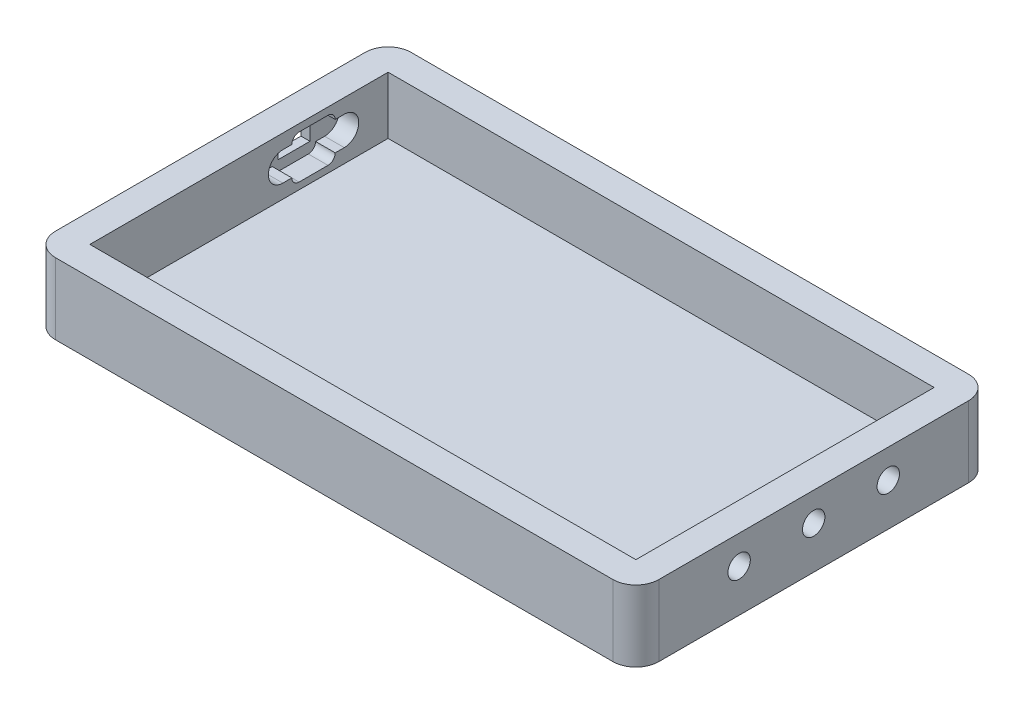
ISO-10303-21;
HEADER;
FILE_DESCRIPTION(('STEP AP214'),'2;1');
FILE_NAME('part.step','',(''),(''),'','','');
FILE_SCHEMA(('AUTOMOTIVE_DESIGN { 1 0 10303 214 1 1 1 1 }'));
ENDSEC;
DATA;
#1=APPLICATION_CONTEXT('core data for automotive mechanical design processes');
#2=APPLICATION_PROTOCOL_DEFINITION('international standard','automotive_design',2000,#1);
#3=PRODUCT_CONTEXT('',#1,'mechanical');
#4=PRODUCT('Part','Part','',(#3));
#5=PRODUCT_RELATED_PRODUCT_CATEGORY('part','',(#4));
#6=PRODUCT_DEFINITION_FORMATION('','',#4);
#7=PRODUCT_DEFINITION_CONTEXT('part definition',#1,'design');
#8=PRODUCT_DEFINITION('design','',#6,#7);
#9=PRODUCT_DEFINITION_SHAPE('','',#8);
#10=(LENGTH_UNIT() NAMED_UNIT(*) SI_UNIT(.MILLI.,.METRE.));
#11=(NAMED_UNIT(*) PLANE_ANGLE_UNIT() SI_UNIT($,.RADIAN.));
#12=(NAMED_UNIT(*) SI_UNIT($,.STERADIAN.) SOLID_ANGLE_UNIT());
#13=UNCERTAINTY_MEASURE_WITH_UNIT(LENGTH_MEASURE(1.E-05),#10,'distance_accuracy_value','');
#14=(GEOMETRIC_REPRESENTATION_CONTEXT(3) GLOBAL_UNCERTAINTY_ASSIGNED_CONTEXT((#13)) GLOBAL_UNIT_ASSIGNED_CONTEXT((#10,
#11,#12)) REPRESENTATION_CONTEXT('',''));
#15=CARTESIAN_POINT('',(0.,0.,0.));
#16=DIRECTION('',(0.,0.,1.));
#17=DIRECTION('',(1.,0.,0.));
#18=AXIS2_PLACEMENT_3D('',#15,#16,#17);
#19=CARTESIAN_POINT('',(-5.4356,11.8694042873479,-57.9125024835682));
#20=DIRECTION('',(-1.,0.,0.));
#21=DIRECTION('',(0.,0.,1.));
#22=AXIS2_PLACEMENT_3D('',#19,#20,#21);
#23=PLANE('',#22);
#24=CARTESIAN_POINT('',(-5.4356,11.8694042873479,-57.9125024835682));
#25=DIRECTION('',(1.,0.,0.));
#26=DIRECTION('',(0.,0.,1.));
#27=AXIS2_PLACEMENT_3D('',#24,#25,#26);
#28=CIRCLE('',#27,2.);
#29=CARTESIAN_POINT('',(-5.4356,13.8694042873479,-57.9125024835682));
#30=VERTEX_POINT('',#29);
#31=CARTESIAN_POINT('',(-5.4356,11.8694042873479,-55.9125024835682));
#32=VERTEX_POINT('',#31);
#33=EDGE_CURVE('E254',#30,#32,#28,.T.);
#34=ORIENTED_EDGE('',*,*,#33,.T.);
#35=DIRECTION('',(0.,0.,1.));
#36=VECTOR('',#35,1.);
#37=CARTESIAN_POINT('',(-5.4356,11.8694042873479,-55.9125024835682));
#38=LINE('',#37,#36);
#39=CARTESIAN_POINT('',(-5.4356,11.8694042873479,-53.4125024835682));
#40=VERTEX_POINT('',#39);
#41=EDGE_CURVE('E257',#32,#40,#38,.T.);
#42=ORIENTED_EDGE('',*,*,#41,.T.);
#43=CARTESIAN_POINT('',(-5.4356,7.86940428734794,-53.4125024835682));
#44=DIRECTION('',(1.,0.,0.));
#45=DIRECTION('',(0.,0.,1.));
#46=AXIS2_PLACEMENT_3D('',#43,#44,#45);
#47=CIRCLE('',#46,4.);
#48=CARTESIAN_POINT('',(-5.4356,3.86940428734794,-53.4125024835682));
#49=VERTEX_POINT('',#48);
#50=EDGE_CURVE('E261',#40,#49,#47,.T.);
#51=ORIENTED_EDGE('',*,*,#50,.T.);
#52=DIRECTION('',(0.,0.,-1.));
#53=VECTOR('',#52,1.);
#54=CARTESIAN_POINT('',(-5.4356,3.86940428734794,-53.4125024835682));
#55=LINE('',#54,#53);
#56=CARTESIAN_POINT('',(-5.4356,3.86940428734795,-55.9125024835682));
#57=VERTEX_POINT('',#56);
#58=EDGE_CURVE('E264',#49,#57,#55,.T.);
#59=ORIENTED_EDGE('',*,*,#58,.T.);
#60=CARTESIAN_POINT('',(-5.4356,3.86940428734795,-57.9125024835682));
#61=DIRECTION('',(1.,0.,0.));
#62=DIRECTION('',(0.,0.,1.));
#63=AXIS2_PLACEMENT_3D('',#60,#61,#62);
#64=CIRCLE('',#63,1.99999999999999);
#65=CARTESIAN_POINT('',(-5.4356,1.86940428734794,-57.9125024835682));
#66=VERTEX_POINT('',#65);
#67=EDGE_CURVE('E267',#57,#66,#64,.T.);
#68=ORIENTED_EDGE('',*,*,#67,.T.);
#69=DIRECTION('',(0.,0.,-1.));
#70=VECTOR('',#69,1.);
#71=CARTESIAN_POINT('',(-5.4356,1.86940428734794,-65.9125025164749));
#72=LINE('',#71,#70);
#73=CARTESIAN_POINT('',(-5.4356,1.86940428734796,-65.9125025164749));
#74=VERTEX_POINT('',#73);
#75=EDGE_CURVE('E270',#66,#74,#72,.T.);
#76=ORIENTED_EDGE('',*,*,#75,.T.);
#77=CARTESIAN_POINT('',(-5.4356,3.86940428734795,-65.912502516475));
#78=DIRECTION('',(1.,0.,0.));
#79=DIRECTION('',(0.,0.,-1.));
#80=AXIS2_PLACEMENT_3D('',#77,#78,#79);
#81=CIRCLE('',#80,1.99999999999999);
#82=CARTESIAN_POINT('',(-5.4356,3.86940428734795,-67.9125025164749));
#83=VERTEX_POINT('',#82);
#84=EDGE_CURVE('E273',#74,#83,#81,.T.);
#85=ORIENTED_EDGE('',*,*,#84,.T.);
#86=DIRECTION('',(0.,0.,-1.));
#87=VECTOR('',#86,1.);
#88=CARTESIAN_POINT('',(-5.4356,3.86940428734795,-70.4125025164749));
#89=LINE('',#88,#87);
#90=CARTESIAN_POINT('',(-5.4356,3.86940428734794,-70.4125025164749));
#91=VERTEX_POINT('',#90);
#92=EDGE_CURVE('E276',#83,#91,#89,.T.);
#93=ORIENTED_EDGE('',*,*,#92,.T.);
#94=CARTESIAN_POINT('',(-5.4356,7.86940428734794,-70.4125025164749));
#95=DIRECTION('',(1.,0.,0.));
#96=DIRECTION('',(0.,0.,-1.));
#97=AXIS2_PLACEMENT_3D('',#94,#95,#96);
#98=CIRCLE('',#97,4.);
#99=CARTESIAN_POINT('',(-5.4356,11.8694042873479,-70.4125025164749));
#100=VERTEX_POINT('',#99);
#101=EDGE_CURVE('E279',#91,#100,#98,.T.);
#102=ORIENTED_EDGE('',*,*,#101,.T.);
#103=DIRECTION('',(0.,0.,1.));
#104=VECTOR('',#103,1.);
#105=CARTESIAN_POINT('',(-5.4356,11.8694042873479,-67.9125025164749));
#106=LINE('',#105,#104);
#107=CARTESIAN_POINT('',(-5.4356,11.8694042873479,-67.9125025164749));
#108=VERTEX_POINT('',#107);
#109=EDGE_CURVE('E282',#100,#108,#106,.T.);
#110=ORIENTED_EDGE('',*,*,#109,.T.);
#111=CARTESIAN_POINT('',(-5.4356,11.8694042873479,-65.9125025164749));
#112=DIRECTION('',(1.,0.,0.));
#113=DIRECTION('',(0.,0.,-1.));
#114=AXIS2_PLACEMENT_3D('',#111,#112,#113);
#115=CIRCLE('',#114,2.);
#116=CARTESIAN_POINT('',(-5.4356,13.8694042873479,-65.9125025164749));
#117=VERTEX_POINT('',#116);
#118=EDGE_CURVE('E285',#108,#117,#115,.T.);
#119=ORIENTED_EDGE('',*,*,#118,.T.);
#120=DIRECTION('',(0.,0.,1.));
#121=VECTOR('',#120,1.);
#122=CARTESIAN_POINT('',(-5.4356,13.8694042873479,-57.9125024835682));
#123=LINE('',#122,#121);
#124=EDGE_CURVE('E288',#117,#30,#123,.T.);
#125=ORIENTED_EDGE('',*,*,#124,.T.);
#126=EDGE_LOOP('',(#34,#42,#51,#59,#68,#76,#85,#93,#102,#110,#119,#125));
#127=FACE_BOUND('',#126,.T.);
#128=DIRECTION('',(0.,0.,-1.));
#129=VECTOR('',#128,1.);
#130=CARTESIAN_POINT('',(-5.4356,4.69440428734794,0.));
#131=LINE('',#130,#129);
#132=CARTESIAN_POINT('',(-5.4356,4.69440428734794,-57.4675025000216));
#133=VERTEX_POINT('',#132);
#134=CARTESIAN_POINT('',(-5.4356,4.69440428734794,-66.3575025000216));
#135=VERTEX_POINT('',#134);
#136=EDGE_CURVE('E224',#133,#135,#131,.T.);
#137=ORIENTED_EDGE('',*,*,#136,.F.);
#138=DIRECTION('',(0.,1.,0.));
#139=VECTOR('',#138,1.);
#140=CARTESIAN_POINT('',(-5.4356,0.,-57.4675025000216));
#141=LINE('',#140,#139);
#142=CARTESIAN_POINT('',(-5.4356,11.0444042873479,-57.4675025000216));
#143=VERTEX_POINT('',#142);
#144=EDGE_CURVE('E237',#133,#143,#141,.T.);
#145=ORIENTED_EDGE('',*,*,#144,.T.);
#146=DIRECTION('',(0.,0.,-1.));
#147=VECTOR('',#146,1.);
#148=CARTESIAN_POINT('',(-5.4356,11.0444042873479,0.));
#149=LINE('',#148,#147);
#150=CARTESIAN_POINT('',(-5.4356,11.0444042873479,-66.3575025000216));
#151=VERTEX_POINT('',#150);
#152=EDGE_CURVE('E47',#143,#151,#149,.T.);
#153=ORIENTED_EDGE('',*,*,#152,.T.);
#154=DIRECTION('',(0.,1.,0.));
#155=VECTOR('',#154,1.);
#156=CARTESIAN_POINT('',(-5.4356,0.,-66.3575025000216));
#157=LINE('',#156,#155);
#158=EDGE_CURVE('E245',#135,#151,#157,.T.);
#159=ORIENTED_EDGE('',*,*,#158,.F.);
#160=EDGE_LOOP('',(#137,#145,#153,#159));
#161=FACE_BOUND('',#160,.T.);
#162=ADVANCED_FACE('F32',(#127,#161),#23,.F.);
#163=CARTESIAN_POINT('',(0.,15.875,0.));
#164=DIRECTION('',(0.,1.,0.));
#165=DIRECTION('',(0.,0.,1.));
#166=AXIS2_PLACEMENT_3D('',#163,#164,#165);
#167=PLANE('',#166);
#168=DIRECTION('',(1.,0.,0.));
#169=VECTOR('',#168,1.);
#170=CARTESIAN_POINT('',(-7.93749999999999,15.875,7.9375));
#171=LINE('',#170,#169);
#172=CARTESIAN_POINT('',(-1.58749999999999,15.875,7.9375));
#173=VERTEX_POINT('',#172);
#174=CARTESIAN_POINT('',(152.7175,15.875,7.9375));
#175=VERTEX_POINT('',#174);
#176=EDGE_CURVE('E409',#173,#175,#171,.T.);
#177=ORIENTED_EDGE('',*,*,#176,.T.);
#178=CARTESIAN_POINT('',(152.7175,15.875,1.5875));
#179=DIRECTION('',(0.,1.,0.));
#180=DIRECTION('',(0.,0.,1.));
#181=AXIS2_PLACEMENT_3D('',#178,#179,#180);
#182=CIRCLE('',#181,6.35);
#183=CARTESIAN_POINT('',(159.0675,15.875,1.5875));
#184=VERTEX_POINT('',#183);
#185=EDGE_CURVE('E445',#175,#184,#182,.T.);
#186=ORIENTED_EDGE('',*,*,#185,.T.);
#187=DIRECTION('',(0.,0.,-1.));
#188=VECTOR('',#187,1.);
#189=CARTESIAN_POINT('',(159.0675,15.875,7.9375));
#190=LINE('',#189,#188);
#191=CARTESIAN_POINT('',(159.0675,15.875,-84.1375));
#192=VERTEX_POINT('',#191);
#193=EDGE_CURVE('E412',#184,#192,#190,.T.);
#194=ORIENTED_EDGE('',*,*,#193,.T.);
#195=CARTESIAN_POINT('',(152.7175,15.875,-84.1375));
#196=DIRECTION('',(0.,1.,0.));
#197=DIRECTION('',(0.,0.,1.));
#198=AXIS2_PLACEMENT_3D('',#195,#196,#197);
#199=CIRCLE('',#198,6.35);
#200=CARTESIAN_POINT('',(152.7175,15.875,-90.4875));
#201=VERTEX_POINT('',#200);
#202=EDGE_CURVE('E439',#192,#201,#199,.T.);
#203=ORIENTED_EDGE('',*,*,#202,.T.);
#204=DIRECTION('',(-1.,0.,0.));
#205=VECTOR('',#204,1.);
#206=CARTESIAN_POINT('',(159.0675,15.875,-90.4875));
#207=LINE('',#206,#205);
#208=CARTESIAN_POINT('',(-1.58749999999999,15.875,-90.4875));
#209=VERTEX_POINT('',#208);
#210=EDGE_CURVE('E415',#201,#209,#207,.T.);
#211=ORIENTED_EDGE('',*,*,#210,.T.);
#212=CARTESIAN_POINT('',(-1.5875,15.875,-84.1375));
#213=DIRECTION('',(0.,1.,0.));
#214=DIRECTION('',(0.,0.,1.));
#215=AXIS2_PLACEMENT_3D('',#212,#213,#214);
#216=CIRCLE('',#215,6.35);
#217=CARTESIAN_POINT('',(-7.9375,15.875,-84.1375));
#218=VERTEX_POINT('',#217);
#219=EDGE_CURVE('E441',#209,#218,#216,.T.);
#220=ORIENTED_EDGE('',*,*,#219,.T.);
#221=DIRECTION('',(0.,0.,1.));
#222=VECTOR('',#221,1.);
#223=CARTESIAN_POINT('',(-7.9375,15.875,-90.4875));
#224=LINE('',#223,#222);
#225=CARTESIAN_POINT('',(-7.9375,15.875,1.58750000000001));
#226=VERTEX_POINT('',#225);
#227=EDGE_CURVE('E418',#218,#226,#224,.T.);
#228=ORIENTED_EDGE('',*,*,#227,.T.);
#229=CARTESIAN_POINT('',(-1.58749999999999,15.875,1.5875));
#230=DIRECTION('',(0.,1.,0.));
#231=DIRECTION('',(0.,0.,1.));
#232=AXIS2_PLACEMENT_3D('',#229,#230,#231);
#233=CIRCLE('',#232,6.35);
#234=EDGE_CURVE('E443',#226,#173,#233,.T.);
#235=ORIENTED_EDGE('',*,*,#234,.T.);
#236=EDGE_LOOP('',(#177,#186,#194,#203,#211,#220,#228,#235));
#237=FACE_BOUND('',#236,.T.);
#238=DIRECTION('',(1.,0.,0.));
#239=VECTOR('',#238,1.);
#240=CARTESIAN_POINT('',(0.,15.875,0.));
#241=LINE('',#240,#239);
#242=CARTESIAN_POINT('',(0.,15.875,0.));
#243=VERTEX_POINT('',#242);
#244=CARTESIAN_POINT('',(151.13,15.875,0.));
#245=VERTEX_POINT('',#244);
#246=EDGE_CURVE('E382',#243,#245,#241,.T.);
#247=ORIENTED_EDGE('',*,*,#246,.F.);
#248=DIRECTION('',(0.,0.,1.));
#249=VECTOR('',#248,1.);
#250=CARTESIAN_POINT('',(0.,15.875,-82.55));
#251=LINE('',#250,#249);
#252=CARTESIAN_POINT('',(0.,15.875,-82.55));
#253=VERTEX_POINT('',#252);
#254=EDGE_CURVE('E380',#253,#243,#251,.T.);
#255=ORIENTED_EDGE('',*,*,#254,.F.);
#256=DIRECTION('',(-1.,0.,0.));
#257=VECTOR('',#256,1.);
#258=CARTESIAN_POINT('',(151.13,15.875,-82.55));
#259=LINE('',#258,#257);
#260=CARTESIAN_POINT('',(151.13,15.875,-82.55));
#261=VERTEX_POINT('',#260);
#262=EDGE_CURVE('E388',#261,#253,#259,.T.);
#263=ORIENTED_EDGE('',*,*,#262,.F.);
#264=DIRECTION('',(0.,0.,-1.));
#265=VECTOR('',#264,1.);
#266=CARTESIAN_POINT('',(151.13,15.875,0.));
#267=LINE('',#266,#265);
#268=EDGE_CURVE('E385',#245,#261,#267,.T.);
#269=ORIENTED_EDGE('',*,*,#268,.F.);
#270=EDGE_LOOP('',(#247,#255,#263,#269));
#271=FACE_BOUND('',#270,.T.);
#272=ADVANCED_FACE('F472',(#237,#271),#167,.T.);
#273=CARTESIAN_POINT('',(-7.93749999999999,15.875,7.9375));
#274=DIRECTION('',(0.,0.,-1.));
#275=DIRECTION('',(-1.,0.,0.));
#276=AXIS2_PLACEMENT_3D('',#273,#274,#275);
#277=PLANE('',#276);
#278=DIRECTION('',(-1.,0.,0.));
#279=VECTOR('',#278,1.);
#280=CARTESIAN_POINT('',(-7.93749999999999,-3.81,7.9375));
#281=LINE('',#280,#279);
#282=CARTESIAN_POINT('',(152.7175,-3.81,7.9375));
#283=VERTEX_POINT('',#282);
#284=CARTESIAN_POINT('',(-1.58749999999999,-3.81,7.9375));
#285=VERTEX_POINT('',#284);
#286=EDGE_CURVE('E353',#283,#285,#281,.T.);
#287=ORIENTED_EDGE('',*,*,#286,.F.);
#288=DIRECTION('',(0.,-1.,0.));
#289=VECTOR('',#288,1.);
#290=CARTESIAN_POINT('',(152.7175,15.875,7.9375));
#291=LINE('',#290,#289);
#292=EDGE_CURVE('E437',#283,#175,#291,.F.);
#293=ORIENTED_EDGE('',*,*,#292,.T.);
#294=ORIENTED_EDGE('',*,*,#176,.F.);
#295=DIRECTION('',(0.,-1.,0.));
#296=VECTOR('',#295,1.);
#297=CARTESIAN_POINT('',(-1.58749999999999,15.875,7.9375));
#298=LINE('',#297,#296);
#299=EDGE_CURVE('E434',#173,#285,#298,.T.);
#300=ORIENTED_EDGE('',*,*,#299,.T.);
#301=EDGE_LOOP('',(#287,#293,#294,#300));
#302=FACE_BOUND('',#301,.T.);
#303=ADVANCED_FACE('F480',(#302),#277,.F.);
#304=CARTESIAN_POINT('',(159.0675,15.875,7.9375));
#305=DIRECTION('',(-1.,0.,0.));
#306=DIRECTION('',(0.,0.,1.));
#307=AXIS2_PLACEMENT_3D('',#304,#305,#306);
#308=PLANE('',#307);
#309=CARTESIAN_POINT('',(159.0675,7.9375,-61.9125));
#310=DIRECTION('',(-1.,0.,0.));
#311=DIRECTION('',(0.,0.,1.));
#312=AXIS2_PLACEMENT_3D('',#309,#310,#311);
#313=CIRCLE('',#312,3.0988);
#314=CARTESIAN_POINT('',(159.0675,7.9375,-58.8137));
#315=VERTEX_POINT('',#314);
#316=EDGE_CURVE('E350',#315,#315,#313,.T.);
#317=ORIENTED_EDGE('',*,*,#316,.T.);
#318=EDGE_LOOP('',(#317));
#319=FACE_BOUND('',#318,.T.);
#320=CARTESIAN_POINT('',(159.0675,7.9375,-41.275));
#321=DIRECTION('',(-1.,0.,0.));
#322=DIRECTION('',(0.,0.,1.));
#323=AXIS2_PLACEMENT_3D('',#320,#321,#322);
#324=CIRCLE('',#323,3.0988);
#325=CARTESIAN_POINT('',(159.0675,7.9375,-38.1762));
#326=VERTEX_POINT('',#325);
#327=EDGE_CURVE('E357',#326,#326,#324,.T.);
#328=ORIENTED_EDGE('',*,*,#327,.T.);
#329=EDGE_LOOP('',(#328));
#330=FACE_BOUND('',#329,.T.);
#331=CARTESIAN_POINT('',(159.0675,7.9375,-20.6375));
#332=DIRECTION('',(-1.,0.,0.));
#333=DIRECTION('',(0.,0.,1.));
#334=AXIS2_PLACEMENT_3D('',#331,#332,#333);
#335=CIRCLE('',#334,3.0988);
#336=CARTESIAN_POINT('',(159.0675,7.9375,-17.5387));
#337=VERTEX_POINT('',#336);
#338=EDGE_CURVE('E363',#337,#337,#335,.T.);
#339=ORIENTED_EDGE('',*,*,#338,.T.);
#340=EDGE_LOOP('',(#339));
#341=FACE_BOUND('',#340,.T.);
#342=ORIENTED_EDGE('',*,*,#193,.F.);
#343=DIRECTION('',(0.,-1.,0.));
#344=VECTOR('',#343,1.);
#345=CARTESIAN_POINT('',(159.0675,15.875,1.5875));
#346=LINE('',#345,#344);
#347=CARTESIAN_POINT('',(159.0675,-3.81,1.5875));
#348=VERTEX_POINT('',#347);
#349=EDGE_CURVE('E423',#184,#348,#346,.T.);
#350=ORIENTED_EDGE('',*,*,#349,.T.);
#351=DIRECTION('',(0.,0.,1.));
#352=VECTOR('',#351,1.);
#353=CARTESIAN_POINT('',(159.0675,-3.81,7.9375));
#354=LINE('',#353,#352);
#355=CARTESIAN_POINT('',(159.0675,-3.81,-84.1375));
#356=VERTEX_POINT('',#355);
#357=EDGE_CURVE('E376',#356,#348,#354,.T.);
#358=ORIENTED_EDGE('',*,*,#357,.F.);
#359=DIRECTION('',(0.,-1.,0.));
#360=VECTOR('',#359,1.);
#361=CARTESIAN_POINT('',(159.0675,15.875,-84.1375));
#362=LINE('',#361,#360);
#363=EDGE_CURVE('E421',#356,#192,#362,.F.);
#364=ORIENTED_EDGE('',*,*,#363,.T.);
#365=EDGE_LOOP('',(#342,#350,#358,#364));
#366=FACE_BOUND('',#365,.T.);
#367=ADVANCED_FACE('F488',(#319,#330,#341,#366),#308,.F.);
#368=CARTESIAN_POINT('',(159.0675,15.875,-90.4875));
#369=DIRECTION('',(0.,0.,1.));
#370=DIRECTION('',(1.,0.,0.));
#371=AXIS2_PLACEMENT_3D('',#368,#369,#370);
#372=PLANE('',#371);
#373=DIRECTION('',(1.,0.,0.));
#374=VECTOR('',#373,1.);
#375=CARTESIAN_POINT('',(159.0675,-3.81,-90.4875));
#376=LINE('',#375,#374);
#377=CARTESIAN_POINT('',(-1.58749999999999,-3.81,-90.4875));
#378=VERTEX_POINT('',#377);
#379=CARTESIAN_POINT('',(152.7175,-3.81,-90.4875));
#380=VERTEX_POINT('',#379);
#381=EDGE_CURVE('E373',#378,#380,#376,.T.);
#382=ORIENTED_EDGE('',*,*,#381,.F.);
#383=DIRECTION('',(0.,-1.,0.));
#384=VECTOR('',#383,1.);
#385=CARTESIAN_POINT('',(-1.58749999999999,15.875,-90.4875));
#386=LINE('',#385,#384);
#387=EDGE_CURVE('E11',#378,#209,#386,.F.);
#388=ORIENTED_EDGE('',*,*,#387,.T.);
#389=ORIENTED_EDGE('',*,*,#210,.F.);
#390=DIRECTION('',(0.,-1.,0.));
#391=VECTOR('',#390,1.);
#392=CARTESIAN_POINT('',(152.7175,15.875,-90.4875));
#393=LINE('',#392,#391);
#394=EDGE_CURVE('E40',#201,#380,#393,.T.);
#395=ORIENTED_EDGE('',*,*,#394,.T.);
#396=EDGE_LOOP('',(#382,#388,#389,#395));
#397=FACE_BOUND('',#396,.T.);
#398=ADVANCED_FACE('F456',(#397),#372,.F.);
#399=CARTESIAN_POINT('',(-7.9375,15.875,-82.55));
#400=DIRECTION('',(1.,0.,0.));
#401=DIRECTION('',(0.,0.,-1.));
#402=AXIS2_PLACEMENT_3D('',#399,#400,#401);
#403=PLANE('',#402);
#404=DIRECTION('',(0.,1.,0.));
#405=VECTOR('',#404,1.);
#406=CARTESIAN_POINT('',(-7.9375,0.,-57.4675025000216));
#407=LINE('',#406,#405);
#408=CARTESIAN_POINT('',(-7.9375,4.69440428734794,-57.4675025000216));
#409=VERTEX_POINT('',#408);
#410=CARTESIAN_POINT('',(-7.9375,11.0444042873479,-57.4675025000216));
#411=VERTEX_POINT('',#410);
#412=EDGE_CURVE('E226',#409,#411,#407,.T.);
#413=ORIENTED_EDGE('',*,*,#412,.F.);
#414=DIRECTION('',(0.,0.,-1.));
#415=VECTOR('',#414,1.);
#416=CARTESIAN_POINT('',(-7.9375,4.69440428734794,0.));
#417=LINE('',#416,#415);
#418=CARTESIAN_POINT('',(-7.9375,4.69440428734794,-66.3575025000216));
#419=VERTEX_POINT('',#418);
#420=EDGE_CURVE('E221',#409,#419,#417,.T.);
#421=ORIENTED_EDGE('',*,*,#420,.T.);
#422=DIRECTION('',(0.,1.,0.));
#423=VECTOR('',#422,1.);
#424=CARTESIAN_POINT('',(-7.9375,0.,-66.3575025000216));
#425=LINE('',#424,#423);
#426=CARTESIAN_POINT('',(-7.9375,11.0444042873479,-66.3575025000216));
#427=VERTEX_POINT('',#426);
#428=EDGE_CURVE('E229',#419,#427,#425,.T.);
#429=ORIENTED_EDGE('',*,*,#428,.T.);
#430=DIRECTION('',(0.,0.,-1.));
#431=VECTOR('',#430,1.);
#432=CARTESIAN_POINT('',(-7.9375,11.0444042873479,0.));
#433=LINE('',#432,#431);
#434=EDGE_CURVE('E233',#411,#427,#433,.T.);
#435=ORIENTED_EDGE('',*,*,#434,.F.);
#436=EDGE_LOOP('',(#413,#421,#429,#435));
#437=FACE_BOUND('',#436,.T.);
#438=DIRECTION('',(0.,0.,-1.));
#439=VECTOR('',#438,1.);
#440=CARTESIAN_POINT('',(-7.9375,-3.81,-90.4875));
#441=LINE('',#440,#439);
#442=CARTESIAN_POINT('',(-7.93749999999999,-3.81,1.58750000000001));
#443=VERTEX_POINT('',#442);
#444=CARTESIAN_POINT('',(-7.9375,-3.81,-84.1375));
#445=VERTEX_POINT('',#444);
#446=EDGE_CURVE('E370',#443,#445,#441,.T.);
#447=ORIENTED_EDGE('',*,*,#446,.F.);
#448=DIRECTION('',(0.,-1.,0.));
#449=VECTOR('',#448,1.);
#450=CARTESIAN_POINT('',(-7.93749999999999,15.875,1.58750000000001));
#451=LINE('',#450,#449);
#452=EDGE_CURVE('E450',#443,#226,#451,.F.);
#453=ORIENTED_EDGE('',*,*,#452,.T.);
#454=ORIENTED_EDGE('',*,*,#227,.F.);
#455=DIRECTION('',(0.,-1.,0.));
#456=VECTOR('',#455,1.);
#457=CARTESIAN_POINT('',(-7.9375,15.875,-84.1375));
#458=LINE('',#457,#456);
#459=EDGE_CURVE('E447',#218,#445,#458,.T.);
#460=ORIENTED_EDGE('',*,*,#459,.T.);
#461=EDGE_LOOP('',(#447,#453,#454,#460));
#462=FACE_BOUND('',#461,.T.);
#463=ADVANCED_FACE('F235',(#437,#462),#403,.F.);
#464=CARTESIAN_POINT('',(0.,15.875,-82.55));
#465=DIRECTION('',(1.,0.,0.));
#466=DIRECTION('',(0.,0.,-1.));
#467=AXIS2_PLACEMENT_3D('',#464,#465,#466);
#468=PLANE('',#467);
#469=CARTESIAN_POINT('',(0.,11.8694042873479,-57.9125024835682));
#470=DIRECTION('',(1.,0.,0.));
#471=DIRECTION('',(0.,0.,1.));
#472=AXIS2_PLACEMENT_3D('',#469,#470,#471);
#473=CIRCLE('',#472,2.);
#474=CARTESIAN_POINT('',(0.,13.8694042873479,-57.9125024835682));
#475=VERTEX_POINT('',#474);
#476=CARTESIAN_POINT('',(0.,11.8694042873479,-55.9125024835682));
#477=VERTEX_POINT('',#476);
#478=EDGE_CURVE('E250',#475,#477,#473,.T.);
#479=ORIENTED_EDGE('',*,*,#478,.F.);
#480=DIRECTION('',(0.,0.,1.));
#481=VECTOR('',#480,1.);
#482=CARTESIAN_POINT('',(0.,13.8694042873479,-57.9125024835682));
#483=LINE('',#482,#481);
#484=CARTESIAN_POINT('',(0.,13.8694042873479,-65.9125025164749));
#485=VERTEX_POINT('',#484);
#486=EDGE_CURVE('E258',#485,#475,#483,.T.);
#487=ORIENTED_EDGE('',*,*,#486,.F.);
#488=CARTESIAN_POINT('',(0.,11.8694042873479,-65.9125025164749));
#489=DIRECTION('',(1.,0.,0.));
#490=DIRECTION('',(0.,0.,-1.));
#491=AXIS2_PLACEMENT_3D('',#488,#489,#490);
#492=CIRCLE('',#491,2.);
#493=CARTESIAN_POINT('',(0.,11.8694042873479,-67.9125025164749));
#494=VERTEX_POINT('',#493);
#495=EDGE_CURVE('E320',#494,#485,#492,.T.);
#496=ORIENTED_EDGE('',*,*,#495,.F.);
#497=DIRECTION('',(0.,0.,1.));
#498=VECTOR('',#497,1.);
#499=CARTESIAN_POINT('',(0.,11.8694042873479,-67.9125025164749));
#500=LINE('',#499,#498);
#501=CARTESIAN_POINT('',(0.,11.8694042873479,-70.4125025164749));
#502=VERTEX_POINT('',#501);
#503=EDGE_CURVE('E317',#502,#494,#500,.T.);
#504=ORIENTED_EDGE('',*,*,#503,.F.);
#505=CARTESIAN_POINT('',(0.,7.86940428734794,-70.4125025164749));
#506=DIRECTION('',(1.,0.,0.));
#507=DIRECTION('',(0.,0.,-1.));
#508=AXIS2_PLACEMENT_3D('',#505,#506,#507);
#509=CIRCLE('',#508,4.);
#510=CARTESIAN_POINT('',(0.,3.86940428734794,-70.4125025164749));
#511=VERTEX_POINT('',#510);
#512=EDGE_CURVE('E314',#511,#502,#509,.T.);
#513=ORIENTED_EDGE('',*,*,#512,.F.);
#514=DIRECTION('',(0.,0.,-1.));
#515=VECTOR('',#514,1.);
#516=CARTESIAN_POINT('',(0.,3.86940428734795,-70.4125025164749));
#517=LINE('',#516,#515);
#518=CARTESIAN_POINT('',(0.,3.86940428734795,-67.9125025164749));
#519=VERTEX_POINT('',#518);
#520=EDGE_CURVE('E311',#519,#511,#517,.T.);
#521=ORIENTED_EDGE('',*,*,#520,.F.);
#522=CARTESIAN_POINT('',(0.,3.86940428734795,-65.912502516475));
#523=DIRECTION('',(1.,0.,0.));
#524=DIRECTION('',(0.,0.,-1.));
#525=AXIS2_PLACEMENT_3D('',#522,#523,#524);
#526=CIRCLE('',#525,1.99999999999999);
#527=CARTESIAN_POINT('',(0.,1.86940428734796,-65.9125025164749));
#528=VERTEX_POINT('',#527);
#529=EDGE_CURVE('E308',#528,#519,#526,.T.);
#530=ORIENTED_EDGE('',*,*,#529,.F.);
#531=DIRECTION('',(0.,0.,-1.));
#532=VECTOR('',#531,1.);
#533=CARTESIAN_POINT('',(0.,1.86940428734794,-65.9125025164749));
#534=LINE('',#533,#532);
#535=CARTESIAN_POINT('',(0.,1.86940428734794,-57.9125024835682));
#536=VERTEX_POINT('',#535);
#537=EDGE_CURVE('E305',#536,#528,#534,.T.);
#538=ORIENTED_EDGE('',*,*,#537,.F.);
#539=CARTESIAN_POINT('',(0.,3.86940428734795,-57.9125024835682));
#540=DIRECTION('',(1.,0.,0.));
#541=DIRECTION('',(0.,0.,1.));
#542=AXIS2_PLACEMENT_3D('',#539,#540,#541);
#543=CIRCLE('',#542,1.99999999999999);
#544=CARTESIAN_POINT('',(0.,3.86940428734795,-55.9125024835682));
#545=VERTEX_POINT('',#544);
#546=EDGE_CURVE('E302',#545,#536,#543,.T.);
#547=ORIENTED_EDGE('',*,*,#546,.F.);
#548=DIRECTION('',(0.,0.,-1.));
#549=VECTOR('',#548,1.);
#550=CARTESIAN_POINT('',(0.,3.86940428734794,-53.4125024835682));
#551=LINE('',#550,#549);
#552=CARTESIAN_POINT('',(0.,3.86940428734794,-53.4125024835682));
#553=VERTEX_POINT('',#552);
#554=EDGE_CURVE('E299',#553,#545,#551,.T.);
#555=ORIENTED_EDGE('',*,*,#554,.F.);
#556=CARTESIAN_POINT('',(0.,7.86940428734794,-53.4125024835682));
#557=DIRECTION('',(1.,0.,0.));
#558=DIRECTION('',(0.,0.,1.));
#559=AXIS2_PLACEMENT_3D('',#556,#557,#558);
#560=CIRCLE('',#559,4.);
#561=CARTESIAN_POINT('',(0.,11.8694042873479,-53.4125024835682));
#562=VERTEX_POINT('',#561);
#563=EDGE_CURVE('E296',#562,#553,#560,.T.);
#564=ORIENTED_EDGE('',*,*,#563,.F.);
#565=DIRECTION('',(0.,0.,1.));
#566=VECTOR('',#565,1.);
#567=CARTESIAN_POINT('',(0.,11.8694042873479,-55.9125024835682));
#568=LINE('',#567,#566);
#569=EDGE_CURVE('E293',#477,#562,#568,.T.);
#570=ORIENTED_EDGE('',*,*,#569,.F.);
#571=EDGE_LOOP('',(#479,#487,#496,#504,#513,#521,#530,#538,#547,#555,#564,#570));
#572=FACE_BOUND('',#571,.T.);
#573=DIRECTION('',(0.,0.,1.));
#574=VECTOR('',#573,1.);
#575=CARTESIAN_POINT('',(0.,0.,-82.55));
#576=LINE('',#575,#574);
#577=CARTESIAN_POINT('',(0.,0.,-82.55));
#578=VERTEX_POINT('',#577);
#579=CARTESIAN_POINT('',(0.,0.,0.));
#580=VERTEX_POINT('',#579);
#581=EDGE_CURVE('E379',#578,#580,#576,.T.);
#582=ORIENTED_EDGE('',*,*,#581,.F.);
#583=DIRECTION('',(0.,-1.,0.));
#584=VECTOR('',#583,1.);
#585=CARTESIAN_POINT('',(0.,15.875,-82.55));
#586=LINE('',#585,#584);
#587=EDGE_CURVE('E390',#253,#578,#586,.T.);
#588=ORIENTED_EDGE('',*,*,#587,.F.);
#589=ORIENTED_EDGE('',*,*,#254,.T.);
#590=DIRECTION('',(0.,-1.,0.));
#591=VECTOR('',#590,1.);
#592=CARTESIAN_POINT('',(0.,15.875,0.));
#593=LINE('',#592,#591);
#594=EDGE_CURVE('E406',#243,#580,#593,.T.);
#595=ORIENTED_EDGE('',*,*,#594,.T.);
#596=EDGE_LOOP('',(#582,#588,#589,#595));
#597=FACE_BOUND('',#596,.T.);
#598=ADVANCED_FACE('F582',(#572,#597),#468,.T.);
#599=CARTESIAN_POINT('',(0.,15.875,0.));
#600=DIRECTION('',(0.,0.,-1.));
#601=DIRECTION('',(-1.,0.,0.));
#602=AXIS2_PLACEMENT_3D('',#599,#600,#601);
#603=PLANE('',#602);
#604=DIRECTION('',(1.,0.,0.));
#605=VECTOR('',#604,1.);
#606=CARTESIAN_POINT('',(0.,0.,0.));
#607=LINE('',#606,#605);
#608=CARTESIAN_POINT('',(151.13,0.,0.));
#609=VERTEX_POINT('',#608);
#610=EDGE_CURVE('E393',#580,#609,#607,.T.);
#611=ORIENTED_EDGE('',*,*,#610,.F.);
#612=ORIENTED_EDGE('',*,*,#594,.F.);
#613=ORIENTED_EDGE('',*,*,#246,.T.);
#614=DIRECTION('',(0.,-1.,0.));
#615=VECTOR('',#614,1.);
#616=CARTESIAN_POINT('',(151.13,15.875,0.));
#617=LINE('',#616,#615);
#618=EDGE_CURVE('E404',#245,#609,#617,.T.);
#619=ORIENTED_EDGE('',*,*,#618,.T.);
#620=EDGE_LOOP('',(#611,#612,#613,#619));
#621=FACE_BOUND('',#620,.T.);
#622=ADVANCED_FACE('F578',(#621),#603,.T.);
#623=CARTESIAN_POINT('',(151.13,15.875,0.));
#624=DIRECTION('',(-1.,0.,0.));
#625=DIRECTION('',(0.,0.,1.));
#626=AXIS2_PLACEMENT_3D('',#623,#624,#625);
#627=PLANE('',#626);
#628=CARTESIAN_POINT('',(151.13,7.9375,-61.9125));
#629=DIRECTION('',(-1.,0.,0.));
#630=DIRECTION('',(0.,0.,1.));
#631=AXIS2_PLACEMENT_3D('',#628,#629,#630);
#632=CIRCLE('',#631,3.0988);
#633=CARTESIAN_POINT('',(151.13,7.9375,-58.8137));
#634=VERTEX_POINT('',#633);
#635=EDGE_CURVE('E354',#634,#634,#632,.T.);
#636=ORIENTED_EDGE('',*,*,#635,.F.);
#637=EDGE_LOOP('',(#636));
#638=FACE_BOUND('',#637,.T.);
#639=CARTESIAN_POINT('',(151.13,7.9375,-41.275));
#640=DIRECTION('',(-1.,0.,0.));
#641=DIRECTION('',(0.,0.,1.));
#642=AXIS2_PLACEMENT_3D('',#639,#640,#641);
#643=CIRCLE('',#642,3.0988);
#644=CARTESIAN_POINT('',(151.13,7.9375,-38.1762));
#645=VERTEX_POINT('',#644);
#646=EDGE_CURVE('E360',#645,#645,#643,.T.);
#647=ORIENTED_EDGE('',*,*,#646,.F.);
#648=EDGE_LOOP('',(#647));
#649=FACE_BOUND('',#648,.T.);
#650=CARTESIAN_POINT('',(151.13,7.9375,-20.6375));
#651=DIRECTION('',(-1.,0.,0.));
#652=DIRECTION('',(0.,0.,1.));
#653=AXIS2_PLACEMENT_3D('',#650,#651,#652);
#654=CIRCLE('',#653,3.0988);
#655=CARTESIAN_POINT('',(151.13,7.9375,-17.5387));
#656=VERTEX_POINT('',#655);
#657=EDGE_CURVE('E327',#656,#656,#654,.T.);
#658=ORIENTED_EDGE('',*,*,#657,.F.);
#659=EDGE_LOOP('',(#658));
#660=FACE_BOUND('',#659,.T.);
#661=DIRECTION('',(0.,0.,-1.));
#662=VECTOR('',#661,1.);
#663=CARTESIAN_POINT('',(151.13,0.,0.));
#664=LINE('',#663,#662);
#665=CARTESIAN_POINT('',(151.13,0.,-82.55));
#666=VERTEX_POINT('',#665);
#667=EDGE_CURVE('E396',#609,#666,#664,.T.);
#668=ORIENTED_EDGE('',*,*,#667,.F.);
#669=ORIENTED_EDGE('',*,*,#618,.F.);
#670=ORIENTED_EDGE('',*,*,#268,.T.);
#671=DIRECTION('',(0.,-1.,0.));
#672=VECTOR('',#671,1.);
#673=CARTESIAN_POINT('',(151.13,15.875,-82.55));
#674=LINE('',#673,#672);
#675=EDGE_CURVE('E402',#261,#666,#674,.T.);
#676=ORIENTED_EDGE('',*,*,#675,.T.);
#677=EDGE_LOOP('',(#668,#669,#670,#676));
#678=FACE_BOUND('',#677,.T.);
#679=ADVANCED_FACE('F574',(#638,#649,#660,#678),#627,.T.);
#680=CARTESIAN_POINT('',(151.13,15.875,-82.55));
#681=DIRECTION('',(0.,0.,1.));
#682=DIRECTION('',(1.,0.,0.));
#683=AXIS2_PLACEMENT_3D('',#680,#681,#682);
#684=PLANE('',#683);
#685=DIRECTION('',(-1.,0.,0.));
#686=VECTOR('',#685,1.);
#687=CARTESIAN_POINT('',(151.13,0.,-82.55));
#688=LINE('',#687,#686);
#689=EDGE_CURVE('E383',#666,#578,#688,.T.);
#690=ORIENTED_EDGE('',*,*,#689,.F.);
#691=ORIENTED_EDGE('',*,*,#675,.F.);
#692=ORIENTED_EDGE('',*,*,#262,.T.);
#693=ORIENTED_EDGE('',*,*,#587,.T.);
#694=EDGE_LOOP('',(#690,#691,#692,#693));
#695=FACE_BOUND('',#694,.T.);
#696=ADVANCED_FACE('F570',(#695),#684,.T.);
#697=CARTESIAN_POINT('',(0.,0.,0.));
#698=DIRECTION('',(0.,1.,0.));
#699=DIRECTION('',(0.,0.,1.));
#700=AXIS2_PLACEMENT_3D('',#697,#698,#699);
#701=PLANE('',#700);
#702=ORIENTED_EDGE('',*,*,#689,.T.);
#703=ORIENTED_EDGE('',*,*,#581,.T.);
#704=ORIENTED_EDGE('',*,*,#610,.T.);
#705=ORIENTED_EDGE('',*,*,#667,.T.);
#706=EDGE_LOOP('',(#702,#703,#704,#705));
#707=FACE_BOUND('',#706,.T.);
#708=ADVANCED_FACE('F567',(#707),#701,.T.);
#709=CARTESIAN_POINT('',(0.,-3.81,0.));
#710=DIRECTION('',(0.,1.,0.));
#711=DIRECTION('',(0.,0.,1.));
#712=AXIS2_PLACEMENT_3D('',#709,#710,#711);
#713=PLANE('',#712);
#714=ORIENTED_EDGE('',*,*,#357,.T.);
#715=CARTESIAN_POINT('',(152.7175,-3.81,1.5875));
#716=DIRECTION('',(0.,1.,0.));
#717=DIRECTION('',(0.,0.,1.));
#718=AXIS2_PLACEMENT_3D('',#715,#716,#717);
#719=CIRCLE('',#718,6.35);
#720=EDGE_CURVE('E432',#348,#283,#719,.F.);
#721=ORIENTED_EDGE('',*,*,#720,.T.);
#722=ORIENTED_EDGE('',*,*,#286,.T.);
#723=CARTESIAN_POINT('',(-1.58749999999999,-3.81,1.5875));
#724=DIRECTION('',(0.,1.,0.));
#725=DIRECTION('',(0.,0.,1.));
#726=AXIS2_PLACEMENT_3D('',#723,#724,#725);
#727=CIRCLE('',#726,6.35);
#728=EDGE_CURVE('E430',#285,#443,#727,.F.);
#729=ORIENTED_EDGE('',*,*,#728,.T.);
#730=ORIENTED_EDGE('',*,*,#446,.T.);
#731=CARTESIAN_POINT('',(-1.5875,-3.81,-84.1375));
#732=DIRECTION('',(0.,1.,0.));
#733=DIRECTION('',(0.,0.,1.));
#734=AXIS2_PLACEMENT_3D('',#731,#732,#733);
#735=CIRCLE('',#734,6.35);
#736=EDGE_CURVE('E428',#445,#378,#735,.F.);
#737=ORIENTED_EDGE('',*,*,#736,.T.);
#738=ORIENTED_EDGE('',*,*,#381,.T.);
#739=CARTESIAN_POINT('',(152.7175,-3.81,-84.1375));
#740=DIRECTION('',(0.,1.,0.));
#741=DIRECTION('',(0.,0.,1.));
#742=AXIS2_PLACEMENT_3D('',#739,#740,#741);
#743=CIRCLE('',#742,6.35);
#744=EDGE_CURVE('E426',#380,#356,#743,.F.);
#745=ORIENTED_EDGE('',*,*,#744,.T.);
#746=EDGE_LOOP('',(#714,#721,#722,#729,#730,#737,#738,#745));
#747=FACE_BOUND('',#746,.T.);
#748=ADVANCED_FACE('F461',(#747),#713,.F.);
#749=CARTESIAN_POINT('',(152.7175,15.875,1.5875));
#750=DIRECTION('',(0.,-1.,0.));
#751=DIRECTION('',(0.,0.,-1.));
#752=AXIS2_PLACEMENT_3D('',#749,#750,#751);
#753=CYLINDRICAL_SURFACE('',#752,6.35);
#754=ORIENTED_EDGE('',*,*,#185,.F.);
#755=ORIENTED_EDGE('',*,*,#292,.F.);
#756=ORIENTED_EDGE('',*,*,#720,.F.);
#757=ORIENTED_EDGE('',*,*,#349,.F.);
#758=EDGE_LOOP('',(#754,#755,#756,#757));
#759=FACE_BOUND('',#758,.T.);
#760=ADVANCED_FACE('F485',(#759),#753,.T.);
#761=CARTESIAN_POINT('',(-1.58749999999999,15.875,1.5875));
#762=DIRECTION('',(0.,-1.,0.));
#763=DIRECTION('',(0.,0.,-1.));
#764=AXIS2_PLACEMENT_3D('',#761,#762,#763);
#765=CYLINDRICAL_SURFACE('',#764,6.35);
#766=ORIENTED_EDGE('',*,*,#234,.F.);
#767=ORIENTED_EDGE('',*,*,#452,.F.);
#768=ORIENTED_EDGE('',*,*,#728,.F.);
#769=ORIENTED_EDGE('',*,*,#299,.F.);
#770=EDGE_LOOP('',(#766,#767,#768,#769));
#771=FACE_BOUND('',#770,.T.);
#772=ADVANCED_FACE('F477',(#771),#765,.T.);
#773=CARTESIAN_POINT('',(-1.5875,15.875,-84.1375));
#774=DIRECTION('',(0.,-1.,0.));
#775=DIRECTION('',(0.,0.,-1.));
#776=AXIS2_PLACEMENT_3D('',#773,#774,#775);
#777=CYLINDRICAL_SURFACE('',#776,6.35);
#778=ORIENTED_EDGE('',*,*,#219,.F.);
#779=ORIENTED_EDGE('',*,*,#387,.F.);
#780=ORIENTED_EDGE('',*,*,#736,.F.);
#781=ORIENTED_EDGE('',*,*,#459,.F.);
#782=EDGE_LOOP('',(#778,#779,#780,#781));
#783=FACE_BOUND('',#782,.T.);
#784=ADVANCED_FACE('F467',(#783),#777,.T.);
#785=CARTESIAN_POINT('',(152.7175,15.875,-84.1375));
#786=DIRECTION('',(0.,-1.,0.));
#787=DIRECTION('',(0.,0.,-1.));
#788=AXIS2_PLACEMENT_3D('',#785,#786,#787);
#789=CYLINDRICAL_SURFACE('',#788,6.35);
#790=ORIENTED_EDGE('',*,*,#202,.F.);
#791=ORIENTED_EDGE('',*,*,#363,.F.);
#792=ORIENTED_EDGE('',*,*,#744,.F.);
#793=ORIENTED_EDGE('',*,*,#394,.F.);
#794=EDGE_LOOP('',(#790,#791,#792,#793));
#795=FACE_BOUND('',#794,.T.);
#796=ADVANCED_FACE('F34',(#795),#789,.T.);
#797=CARTESIAN_POINT('',(159.0675,7.9375,-20.6375));
#798=DIRECTION('',(-1.,0.,0.));
#799=DIRECTION('',(0.,0.,1.));
#800=AXIS2_PLACEMENT_3D('',#797,#798,#799);
#801=CYLINDRICAL_SURFACE('',#800,3.0988);
#802=ORIENTED_EDGE('',*,*,#338,.F.);
#803=EDGE_LOOP('',(#802));
#804=FACE_BOUND('',#803,.T.);
#805=ORIENTED_EDGE('',*,*,#657,.T.);
#806=EDGE_LOOP('',(#805));
#807=FACE_BOUND('',#806,.T.);
#808=ADVANCED_FACE('F491',(#804,#807),#801,.F.);
#809=CARTESIAN_POINT('',(159.0675,7.9375,-41.275));
#810=DIRECTION('',(-1.,0.,0.));
#811=DIRECTION('',(0.,0.,1.));
#812=AXIS2_PLACEMENT_3D('',#809,#810,#811);
#813=CYLINDRICAL_SURFACE('',#812,3.0988);
#814=ORIENTED_EDGE('',*,*,#327,.F.);
#815=EDGE_LOOP('',(#814));
#816=FACE_BOUND('',#815,.T.);
#817=ORIENTED_EDGE('',*,*,#646,.T.);
#818=EDGE_LOOP('',(#817));
#819=FACE_BOUND('',#818,.T.);
#820=ADVANCED_FACE('F496',(#816,#819),#813,.F.);
#821=CARTESIAN_POINT('',(159.0675,7.9375,-61.9125));
#822=DIRECTION('',(-1.,0.,0.));
#823=DIRECTION('',(0.,0.,1.));
#824=AXIS2_PLACEMENT_3D('',#821,#822,#823);
#825=CYLINDRICAL_SURFACE('',#824,3.0988);
#826=ORIENTED_EDGE('',*,*,#316,.F.);
#827=EDGE_LOOP('',(#826));
#828=FACE_BOUND('',#827,.T.);
#829=ORIENTED_EDGE('',*,*,#635,.T.);
#830=EDGE_LOOP('',(#829));
#831=FACE_BOUND('',#830,.T.);
#832=ADVANCED_FACE('F557',(#828,#831),#825,.F.);
#833=CARTESIAN_POINT('',(-5.4356,11.8694042873479,-57.9125024835682));
#834=DIRECTION('',(1.,0.,0.));
#835=DIRECTION('',(0.,0.,-1.));
#836=AXIS2_PLACEMENT_3D('',#833,#834,#835);
#837=CYLINDRICAL_SURFACE('',#836,2.);
#838=ORIENTED_EDGE('',*,*,#478,.T.);
#839=DIRECTION('',(1.,0.,0.));
#840=VECTOR('',#839,1.);
#841=CARTESIAN_POINT('',(-5.4356,11.8694042873479,-55.9125024835682));
#842=LINE('',#841,#840);
#843=EDGE_CURVE('E291',#32,#477,#842,.T.);
#844=ORIENTED_EDGE('',*,*,#843,.F.);
#845=ORIENTED_EDGE('',*,*,#33,.F.);
#846=DIRECTION('',(1.,0.,0.));
#847=VECTOR('',#846,1.);
#848=CARTESIAN_POINT('',(-5.4356,13.8694042873479,-57.9125024835682));
#849=LINE('',#848,#847);
#850=EDGE_CURVE('E325',#30,#475,#849,.T.);
#851=ORIENTED_EDGE('',*,*,#850,.T.);
#852=EDGE_LOOP('',(#838,#844,#845,#851));
#853=FACE_BOUND('',#852,.T.);
#854=ADVANCED_FACE('F514',(#853),#837,.F.);
#855=CARTESIAN_POINT('',(-5.4356,13.8694042873479,-57.9125024835682));
#856=DIRECTION('',(0.,1.,0.));
#857=DIRECTION('',(0.,0.,1.));
#858=AXIS2_PLACEMENT_3D('',#855,#856,#857);
#859=PLANE('',#858);
#860=ORIENTED_EDGE('',*,*,#486,.T.);
#861=ORIENTED_EDGE('',*,*,#850,.F.);
#862=ORIENTED_EDGE('',*,*,#124,.F.);
#863=DIRECTION('',(1.,0.,0.));
#864=VECTOR('',#863,1.);
#865=CARTESIAN_POINT('',(-5.4356,13.8694042873479,-65.9125025164749));
#866=LINE('',#865,#864);
#867=EDGE_CURVE('E328',#117,#485,#866,.T.);
#868=ORIENTED_EDGE('',*,*,#867,.T.);
#869=EDGE_LOOP('',(#860,#861,#862,#868));
#870=FACE_BOUND('',#869,.T.);
#871=ADVANCED_FACE('F510',(#870),#859,.F.);
#872=CARTESIAN_POINT('',(-5.4356,11.8694042873479,-65.9125025164749));
#873=DIRECTION('',(1.,0.,0.));
#874=DIRECTION('',(0.,0.,-1.));
#875=AXIS2_PLACEMENT_3D('',#872,#873,#874);
#876=CYLINDRICAL_SURFACE('',#875,2.);
#877=ORIENTED_EDGE('',*,*,#495,.T.);
#878=ORIENTED_EDGE('',*,*,#867,.F.);
#879=ORIENTED_EDGE('',*,*,#118,.F.);
#880=DIRECTION('',(1.,0.,0.));
#881=VECTOR('',#880,1.);
#882=CARTESIAN_POINT('',(-5.4356,11.8694042873479,-67.9125025164749));
#883=LINE('',#882,#881);
#884=EDGE_CURVE('E330',#108,#494,#883,.T.);
#885=ORIENTED_EDGE('',*,*,#884,.T.);
#886=EDGE_LOOP('',(#877,#878,#879,#885));
#887=FACE_BOUND('',#886,.T.);
#888=ADVANCED_FACE('F513',(#887),#876,.F.);
#889=CARTESIAN_POINT('',(-5.4356,11.8694042873479,-67.9125025164749));
#890=DIRECTION('',(0.,1.,0.));
#891=DIRECTION('',(0.,0.,1.));
#892=AXIS2_PLACEMENT_3D('',#889,#890,#891);
#893=PLANE('',#892);
#894=ORIENTED_EDGE('',*,*,#503,.T.);
#895=ORIENTED_EDGE('',*,*,#884,.F.);
#896=ORIENTED_EDGE('',*,*,#109,.F.);
#897=DIRECTION('',(1.,0.,0.));
#898=VECTOR('',#897,1.);
#899=CARTESIAN_POINT('',(-5.4356,11.8694042873479,-70.4125025164749));
#900=LINE('',#899,#898);
#901=EDGE_CURVE('E332',#100,#502,#900,.T.);
#902=ORIENTED_EDGE('',*,*,#901,.T.);
#903=EDGE_LOOP('',(#894,#895,#896,#902));
#904=FACE_BOUND('',#903,.T.);
#905=ADVANCED_FACE('F518',(#904),#893,.F.);
#906=CARTESIAN_POINT('',(-5.4356,7.86940428734794,-70.4125025164749));
#907=DIRECTION('',(1.,0.,0.));
#908=DIRECTION('',(0.,0.,-1.));
#909=AXIS2_PLACEMENT_3D('',#906,#907,#908);
#910=CYLINDRICAL_SURFACE('',#909,4.);
#911=ORIENTED_EDGE('',*,*,#512,.T.);
#912=ORIENTED_EDGE('',*,*,#901,.F.);
#913=ORIENTED_EDGE('',*,*,#101,.F.);
#914=DIRECTION('',(1.,0.,0.));
#915=VECTOR('',#914,1.);
#916=CARTESIAN_POINT('',(-5.4356,3.86940428734794,-70.4125025164749));
#917=LINE('',#916,#915);
#918=EDGE_CURVE('E334',#91,#511,#917,.T.);
#919=ORIENTED_EDGE('',*,*,#918,.T.);
#920=EDGE_LOOP('',(#911,#912,#913,#919));
#921=FACE_BOUND('',#920,.T.);
#922=ADVANCED_FACE('F522',(#921),#910,.F.);
#923=CARTESIAN_POINT('',(-5.4356,3.86940428734795,-70.4125025164749));
#924=DIRECTION('',(0.,-1.,0.));
#925=DIRECTION('',(0.,0.,-1.));
#926=AXIS2_PLACEMENT_3D('',#923,#924,#925);
#927=PLANE('',#926);
#928=ORIENTED_EDGE('',*,*,#520,.T.);
#929=ORIENTED_EDGE('',*,*,#918,.F.);
#930=ORIENTED_EDGE('',*,*,#92,.F.);
#931=DIRECTION('',(1.,0.,0.));
#932=VECTOR('',#931,1.);
#933=CARTESIAN_POINT('',(-5.4356,3.86940428734795,-67.9125025164749));
#934=LINE('',#933,#932);
#935=EDGE_CURVE('E336',#83,#519,#934,.T.);
#936=ORIENTED_EDGE('',*,*,#935,.T.);
#937=EDGE_LOOP('',(#928,#929,#930,#936));
#938=FACE_BOUND('',#937,.T.);
#939=ADVANCED_FACE('F526',(#938),#927,.F.);
#940=CARTESIAN_POINT('',(-5.4356,3.86940428734795,-65.912502516475));
#941=DIRECTION('',(1.,0.,0.));
#942=DIRECTION('',(0.,0.,-1.));
#943=AXIS2_PLACEMENT_3D('',#940,#941,#942);
#944=CYLINDRICAL_SURFACE('',#943,1.99999999999999);
#945=ORIENTED_EDGE('',*,*,#529,.T.);
#946=ORIENTED_EDGE('',*,*,#935,.F.);
#947=ORIENTED_EDGE('',*,*,#84,.F.);
#948=DIRECTION('',(1.,0.,0.));
#949=VECTOR('',#948,1.);
#950=CARTESIAN_POINT('',(-5.4356,1.86940428734796,-65.9125025164749));
#951=LINE('',#950,#949);
#952=EDGE_CURVE('E338',#74,#528,#951,.T.);
#953=ORIENTED_EDGE('',*,*,#952,.T.);
#954=EDGE_LOOP('',(#945,#946,#947,#953));
#955=FACE_BOUND('',#954,.T.);
#956=ADVANCED_FACE('F530',(#955),#944,.F.);
#957=CARTESIAN_POINT('',(-5.4356,1.86940428734794,-65.9125025164749));
#958=DIRECTION('',(0.,-1.,0.));
#959=DIRECTION('',(0.,0.,-1.));
#960=AXIS2_PLACEMENT_3D('',#957,#958,#959);
#961=PLANE('',#960);
#962=ORIENTED_EDGE('',*,*,#537,.T.);
#963=ORIENTED_EDGE('',*,*,#952,.F.);
#964=ORIENTED_EDGE('',*,*,#75,.F.);
#965=DIRECTION('',(1.,0.,0.));
#966=VECTOR('',#965,1.);
#967=CARTESIAN_POINT('',(-5.4356,1.86940428734794,-57.9125024835682));
#968=LINE('',#967,#966);
#969=EDGE_CURVE('E340',#66,#536,#968,.T.);
#970=ORIENTED_EDGE('',*,*,#969,.T.);
#971=EDGE_LOOP('',(#962,#963,#964,#970));
#972=FACE_BOUND('',#971,.T.);
#973=ADVANCED_FACE('F534',(#972),#961,.F.);
#974=CARTESIAN_POINT('',(-5.4356,3.86940428734795,-57.9125024835682));
#975=DIRECTION('',(1.,0.,0.));
#976=DIRECTION('',(0.,0.,-1.));
#977=AXIS2_PLACEMENT_3D('',#974,#975,#976);
#978=CYLINDRICAL_SURFACE('',#977,1.99999999999999);
#979=ORIENTED_EDGE('',*,*,#546,.T.);
#980=ORIENTED_EDGE('',*,*,#969,.F.);
#981=ORIENTED_EDGE('',*,*,#67,.F.);
#982=DIRECTION('',(1.,0.,0.));
#983=VECTOR('',#982,1.);
#984=CARTESIAN_POINT('',(-5.4356,3.86940428734795,-55.9125024835682));
#985=LINE('',#984,#983);
#986=EDGE_CURVE('E342',#57,#545,#985,.T.);
#987=ORIENTED_EDGE('',*,*,#986,.T.);
#988=EDGE_LOOP('',(#979,#980,#981,#987));
#989=FACE_BOUND('',#988,.T.);
#990=ADVANCED_FACE('F538',(#989),#978,.F.);
#991=CARTESIAN_POINT('',(-5.4356,3.86940428734794,-53.4125024835682));
#992=DIRECTION('',(0.,-1.,0.));
#993=DIRECTION('',(0.,0.,-1.));
#994=AXIS2_PLACEMENT_3D('',#991,#992,#993);
#995=PLANE('',#994);
#996=ORIENTED_EDGE('',*,*,#554,.T.);
#997=ORIENTED_EDGE('',*,*,#986,.F.);
#998=ORIENTED_EDGE('',*,*,#58,.F.);
#999=DIRECTION('',(1.,0.,0.));
#1000=VECTOR('',#999,1.);
#1001=CARTESIAN_POINT('',(-5.4356,3.86940428734794,-53.4125024835682));
#1002=LINE('',#1001,#1000);
#1003=EDGE_CURVE('E344',#49,#553,#1002,.T.);
#1004=ORIENTED_EDGE('',*,*,#1003,.T.);
#1005=EDGE_LOOP('',(#996,#997,#998,#1004));
#1006=FACE_BOUND('',#1005,.T.);
#1007=ADVANCED_FACE('F542',(#1006),#995,.F.);
#1008=CARTESIAN_POINT('',(-5.4356,7.86940428734794,-53.4125024835682));
#1009=DIRECTION('',(1.,0.,0.));
#1010=DIRECTION('',(0.,0.,-1.));
#1011=AXIS2_PLACEMENT_3D('',#1008,#1009,#1010);
#1012=CYLINDRICAL_SURFACE('',#1011,4.);
#1013=ORIENTED_EDGE('',*,*,#563,.T.);
#1014=ORIENTED_EDGE('',*,*,#1003,.F.);
#1015=ORIENTED_EDGE('',*,*,#50,.F.);
#1016=DIRECTION('',(1.,0.,0.));
#1017=VECTOR('',#1016,1.);
#1018=CARTESIAN_POINT('',(-5.4356,11.8694042873479,-53.4125024835682));
#1019=LINE('',#1018,#1017);
#1020=EDGE_CURVE('E346',#40,#562,#1019,.T.);
#1021=ORIENTED_EDGE('',*,*,#1020,.T.);
#1022=EDGE_LOOP('',(#1013,#1014,#1015,#1021));
#1023=FACE_BOUND('',#1022,.T.);
#1024=ADVANCED_FACE('F546',(#1023),#1012,.F.);
#1025=CARTESIAN_POINT('',(-5.4356,11.8694042873479,-55.9125024835682));
#1026=DIRECTION('',(0.,1.,0.));
#1027=DIRECTION('',(0.,0.,1.));
#1028=AXIS2_PLACEMENT_3D('',#1025,#1026,#1027);
#1029=PLANE('',#1028);
#1030=ORIENTED_EDGE('',*,*,#569,.T.);
#1031=ORIENTED_EDGE('',*,*,#1020,.F.);
#1032=ORIENTED_EDGE('',*,*,#41,.F.);
#1033=ORIENTED_EDGE('',*,*,#843,.T.);
#1034=EDGE_LOOP('',(#1030,#1031,#1032,#1033));
#1035=FACE_BOUND('',#1034,.T.);
#1036=ADVANCED_FACE('F550',(#1035),#1029,.F.);
#1037=CARTESIAN_POINT('',(-7.9375,4.69440428734794,0.));
#1038=DIRECTION('',(0.,-1.,0.));
#1039=DIRECTION('',(0.,0.,-1.));
#1040=AXIS2_PLACEMENT_3D('',#1037,#1038,#1039);
#1041=PLANE('',#1040);
#1042=ORIENTED_EDGE('',*,*,#136,.T.);
#1043=DIRECTION('',(1.,0.,0.));
#1044=VECTOR('',#1043,1.);
#1045=CARTESIAN_POINT('',(-7.9375,4.69440428734794,-66.3575025000216));
#1046=LINE('',#1045,#1044);
#1047=EDGE_CURVE('E218',#419,#135,#1046,.T.);
#1048=ORIENTED_EDGE('',*,*,#1047,.F.);
#1049=ORIENTED_EDGE('',*,*,#420,.F.);
#1050=DIRECTION('',(1.,0.,0.));
#1051=VECTOR('',#1050,1.);
#1052=CARTESIAN_POINT('',(-7.9375,4.69440428734794,-57.4675025000216));
#1053=LINE('',#1052,#1051);
#1054=EDGE_CURVE('E248',#409,#133,#1053,.T.);
#1055=ORIENTED_EDGE('',*,*,#1054,.T.);
#1056=EDGE_LOOP('',(#1042,#1048,#1049,#1055));
#1057=FACE_BOUND('',#1056,.T.);
#1058=ADVANCED_FACE('F219',(#1057),#1041,.F.);
#1059=CARTESIAN_POINT('',(-7.9375,0.,-57.4675025000216));
#1060=DIRECTION('',(0.,0.,-1.));
#1061=DIRECTION('',(-1.,0.,0.));
#1062=AXIS2_PLACEMENT_3D('',#1059,#1060,#1061);
#1063=PLANE('',#1062);
#1064=ORIENTED_EDGE('',*,*,#144,.F.);
#1065=ORIENTED_EDGE('',*,*,#1054,.F.);
#1066=ORIENTED_EDGE('',*,*,#412,.T.);
#1067=DIRECTION('',(1.,0.,0.));
#1068=VECTOR('',#1067,1.);
#1069=CARTESIAN_POINT('',(-7.9375,11.0444042873479,-57.4675025000216));
#1070=LINE('',#1069,#1068);
#1071=EDGE_CURVE('E251',#411,#143,#1070,.T.);
#1072=ORIENTED_EDGE('',*,*,#1071,.T.);
#1073=EDGE_LOOP('',(#1064,#1065,#1066,#1072));
#1074=FACE_BOUND('',#1073,.T.);
#1075=ADVANCED_FACE('F745',(#1074),#1063,.T.);
#1076=CARTESIAN_POINT('',(-7.9375,11.0444042873479,0.));
#1077=DIRECTION('',(0.,-1.,0.));
#1078=DIRECTION('',(0.,0.,-1.));
#1079=AXIS2_PLACEMENT_3D('',#1076,#1077,#1078);
#1080=PLANE('',#1079);
#1081=ORIENTED_EDGE('',*,*,#152,.F.);
#1082=ORIENTED_EDGE('',*,*,#1071,.F.);
#1083=ORIENTED_EDGE('',*,*,#434,.T.);
#1084=DIRECTION('',(1.,0.,0.));
#1085=VECTOR('',#1084,1.);
#1086=CARTESIAN_POINT('',(-7.9375,11.0444042873479,-66.3575025000216));
#1087=LINE('',#1086,#1085);
#1088=EDGE_CURVE('E54',#427,#151,#1087,.T.);
#1089=ORIENTED_EDGE('',*,*,#1088,.T.);
#1090=EDGE_LOOP('',(#1081,#1082,#1083,#1089));
#1091=FACE_BOUND('',#1090,.T.);
#1092=ADVANCED_FACE('F753',(#1091),#1080,.T.);
#1093=CARTESIAN_POINT('',(-7.9375,0.,-66.3575025000216));
#1094=DIRECTION('',(0.,0.,-1.));
#1095=DIRECTION('',(-1.,0.,0.));
#1096=AXIS2_PLACEMENT_3D('',#1093,#1094,#1095);
#1097=PLANE('',#1096);
#1098=ORIENTED_EDGE('',*,*,#158,.T.);
#1099=ORIENTED_EDGE('',*,*,#1088,.F.);
#1100=ORIENTED_EDGE('',*,*,#428,.F.);
#1101=ORIENTED_EDGE('',*,*,#1047,.T.);
#1102=EDGE_LOOP('',(#1098,#1099,#1100,#1101));
#1103=FACE_BOUND('',#1102,.T.);
#1104=ADVANCED_FACE('F230',(#1103),#1097,.F.);
#1105=CLOSED_SHELL('',(#162,#272,#303,#367,#398,#463,#598,#622,#679,#696,#708,#748,#760,#772,
#784,#796,#808,#820,#832,#854,#871,#888,#905,#922,#939,#956,#973,#990,#1007,#1024,#1036,#1058,
#1075,#1092,#1104));
#1106=MANIFOLD_SOLID_BREP('B2',#1105);
#1107=ADVANCED_BREP_SHAPE_REPRESENTATION('',(#18,#1106),#14);
#1108=SHAPE_DEFINITION_REPRESENTATION(#9,#1107);
ENDSEC;
END-ISO-10303-21;
